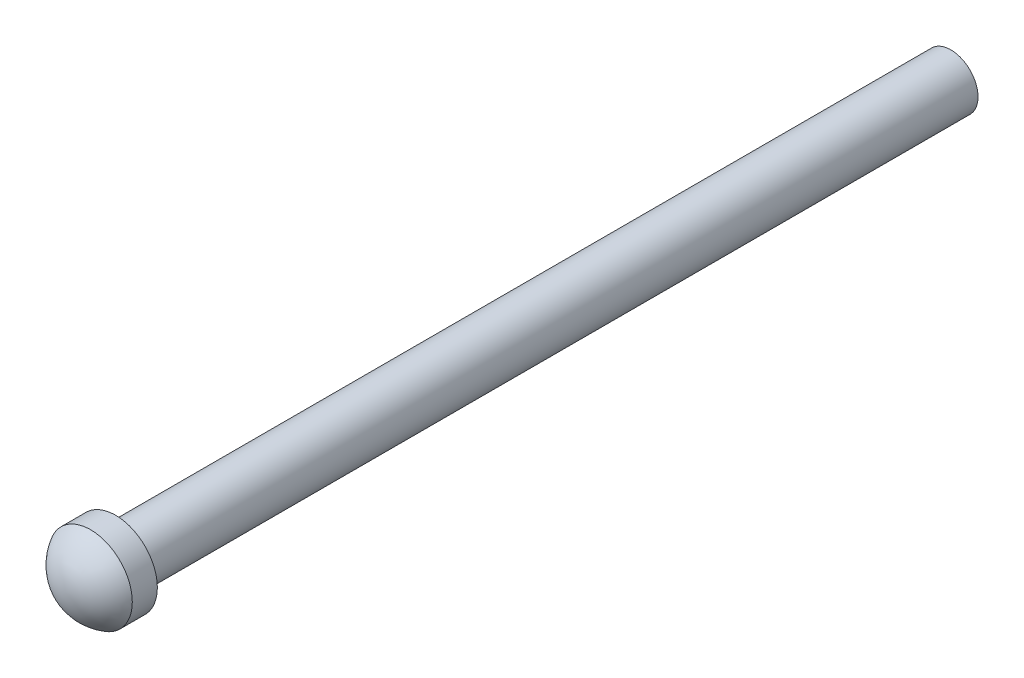
ISO-10303-21;
HEADER;
FILE_DESCRIPTION(('STEP AP214'),'2;1');
FILE_NAME('part.step','',(''),(''),'','','');
FILE_SCHEMA(('AUTOMOTIVE_DESIGN { 1 0 10303 214 1 1 1 1 }'));
ENDSEC;
DATA;
#1=APPLICATION_CONTEXT('core data for automotive mechanical design processes');
#2=APPLICATION_PROTOCOL_DEFINITION('international standard','automotive_design',2000,#1);
#3=PRODUCT_CONTEXT('',#1,'mechanical');
#4=PRODUCT('Part','Part','',(#3));
#5=PRODUCT_RELATED_PRODUCT_CATEGORY('part','',(#4));
#6=PRODUCT_DEFINITION_FORMATION('','',#4);
#7=PRODUCT_DEFINITION_CONTEXT('part definition',#1,'design');
#8=PRODUCT_DEFINITION('design','',#6,#7);
#9=PRODUCT_DEFINITION_SHAPE('','',#8);
#10=(LENGTH_UNIT() NAMED_UNIT(*) SI_UNIT(.MILLI.,.METRE.));
#11=(NAMED_UNIT(*) PLANE_ANGLE_UNIT() SI_UNIT($,.RADIAN.));
#12=(NAMED_UNIT(*) SI_UNIT($,.STERADIAN.) SOLID_ANGLE_UNIT());
#13=UNCERTAINTY_MEASURE_WITH_UNIT(LENGTH_MEASURE(1.E-05),#10,'distance_accuracy_value','');
#14=(GEOMETRIC_REPRESENTATION_CONTEXT(3) GLOBAL_UNCERTAINTY_ASSIGNED_CONTEXT((#13)) GLOBAL_UNIT_ASSIGNED_CONTEXT((#10,
#11,#12)) REPRESENTATION_CONTEXT('',''));
#15=CARTESIAN_POINT('',(0.,0.,0.));
#16=DIRECTION('',(0.,0.,1.));
#17=DIRECTION('',(1.,0.,0.));
#18=AXIS2_PLACEMENT_3D('',#15,#16,#17);
#19=CARTESIAN_POINT('',(5.,60.,-100.));
#20=DIRECTION('',(0.,0.,1.));
#21=DIRECTION('',(1.,0.,0.));
#22=AXIS2_PLACEMENT_3D('',#19,#20,#21);
#23=PLANE('',#22);
#24=CARTESIAN_POINT('',(5.,60.,-100.));
#25=DIRECTION('',(0.,0.,1.));
#26=DIRECTION('',(1.,0.,0.));
#27=AXIS2_PLACEMENT_3D('',#24,#25,#26);
#28=CIRCLE('',#27,3.25);
#29=CARTESIAN_POINT('',(8.25,60.,-100.));
#30=VERTEX_POINT('',#29);
#31=EDGE_CURVE('E10',#30,#30,#28,.T.);
#32=ORIENTED_EDGE('',*,*,#31,.F.);
#33=EDGE_LOOP('',(#32));
#34=FACE_BOUND('',#33,.T.);
#35=ADVANCED_FACE('F35',(#34),#23,.F.);
#36=CARTESIAN_POINT('',(5.,60.,0.));
#37=DIRECTION('',(0.,0.,-1.));
#38=DIRECTION('',(-1.,0.,0.));
#39=AXIS2_PLACEMENT_3D('',#36,#37,#38);
#40=CYLINDRICAL_SURFACE('',#39,3.25);
#41=ORIENTED_EDGE('',*,*,#31,.T.);
#42=EDGE_LOOP('',(#41));
#43=FACE_BOUND('',#42,.T.);
#44=CARTESIAN_POINT('',(5.,60.,0.));
#45=DIRECTION('',(0.,0.,1.));
#46=DIRECTION('',(1.,0.,0.));
#47=AXIS2_PLACEMENT_3D('',#44,#45,#46);
#48=CIRCLE('',#47,3.25);
#49=CARTESIAN_POINT('',(8.25,60.,0.));
#50=VERTEX_POINT('',#49);
#51=EDGE_CURVE('E43',#50,#50,#48,.T.);
#52=ORIENTED_EDGE('',*,*,#51,.F.);
#53=EDGE_LOOP('',(#52));
#54=FACE_BOUND('',#53,.T.);
#55=ADVANCED_FACE('F59',(#43,#54),#40,.T.);
#56=CARTESIAN_POINT('',(5.,60.,3.));
#57=DIRECTION('',(0.,0.,-1.));
#58=DIRECTION('',(-1.,0.,0.));
#59=AXIS2_PLACEMENT_3D('',#56,#57,#58);
#60=CYLINDRICAL_SURFACE('',#59,5.);
#61=CARTESIAN_POINT('',(5.,60.,3.));
#62=DIRECTION('',(0.,0.,1.));
#63=DIRECTION('',(1.,0.,0.));
#64=AXIS2_PLACEMENT_3D('',#61,#62,#63);
#65=CIRCLE('',#64,5.);
#66=CARTESIAN_POINT('',(10.,60.,3.));
#67=VERTEX_POINT('',#66);
#68=EDGE_CURVE('E39',#67,#67,#65,.T.);
#69=ORIENTED_EDGE('',*,*,#68,.F.);
#70=EDGE_LOOP('',(#69));
#71=FACE_BOUND('',#70,.T.);
#72=CARTESIAN_POINT('',(5.,60.,0.));
#73=DIRECTION('',(0.,0.,1.));
#74=DIRECTION('',(1.,0.,0.));
#75=AXIS2_PLACEMENT_3D('',#72,#73,#74);
#76=CIRCLE('',#75,5.);
#77=CARTESIAN_POINT('',(10.,60.,0.));
#78=VERTEX_POINT('',#77);
#79=EDGE_CURVE('E49',#78,#78,#76,.T.);
#80=ORIENTED_EDGE('',*,*,#79,.T.);
#81=EDGE_LOOP('',(#80));
#82=FACE_BOUND('',#81,.T.);
#83=ADVANCED_FACE('F57',(#71,#82),#60,.T.);
#84=CARTESIAN_POINT('',(5.,60.,0.333333333333338));
#85=DIRECTION('',(0.,0.,1.));
#86=DIRECTION('',(1.,0.,0.));
#87=AXIS2_PLACEMENT_3D('',#84,#85,#86);
#88=SPHERICAL_SURFACE('',#87,5.66666666666666);
#89=ORIENTED_EDGE('',*,*,#68,.T.);
#90=EDGE_LOOP('',(#89));
#91=FACE_BOUND('',#90,.T.);
#92=ADVANCED_FACE('F37',(#91),#88,.T.);
#93=CARTESIAN_POINT('',(5.,60.,0.));
#94=DIRECTION('',(0.,0.,1.));
#95=DIRECTION('',(1.,0.,0.));
#96=AXIS2_PLACEMENT_3D('',#93,#94,#95);
#97=PLANE('',#96);
#98=ORIENTED_EDGE('',*,*,#51,.T.);
#99=EDGE_LOOP('',(#98));
#100=FACE_BOUND('',#99,.T.);
#101=ORIENTED_EDGE('',*,*,#79,.F.);
#102=EDGE_LOOP('',(#101));
#103=FACE_BOUND('',#102,.T.);
#104=ADVANCED_FACE('F65',(#100,#103),#97,.F.);
#105=CLOSED_SHELL('',(#35,#55,#83,#92,#104));
#106=MANIFOLD_SOLID_BREP('B2',#105);
#107=ADVANCED_BREP_SHAPE_REPRESENTATION('',(#18,#106),#14);
#108=SHAPE_DEFINITION_REPRESENTATION(#9,#107);
ENDSEC;
END-ISO-10303-21;
